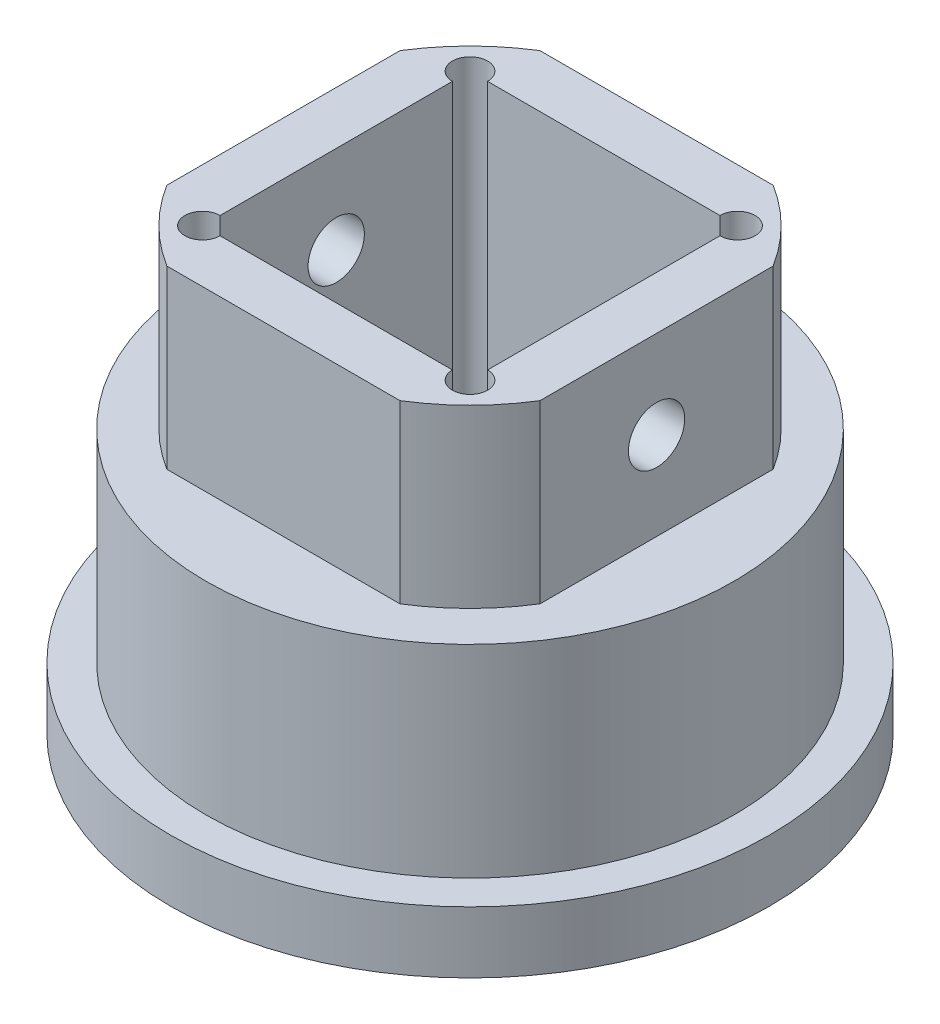
ISO-10303-21;
HEADER;
FILE_DESCRIPTION(('STEP AP214'),'2;1');
FILE_NAME('part.step','',(''),(''),'','','');
FILE_SCHEMA(('AUTOMOTIVE_DESIGN { 1 0 10303 214 1 1 1 1 }'));
ENDSEC;
DATA;
#1=APPLICATION_CONTEXT('core data for automotive mechanical design processes');
#2=APPLICATION_PROTOCOL_DEFINITION('international standard','automotive_design',2000,#1);
#3=PRODUCT_CONTEXT('',#1,'mechanical');
#4=PRODUCT('Part','Part','',(#3));
#5=PRODUCT_RELATED_PRODUCT_CATEGORY('part','',(#4));
#6=PRODUCT_DEFINITION_FORMATION('','',#4);
#7=PRODUCT_DEFINITION_CONTEXT('part definition',#1,'design');
#8=PRODUCT_DEFINITION('design','',#6,#7);
#9=PRODUCT_DEFINITION_SHAPE('','',#8);
#10=(LENGTH_UNIT() NAMED_UNIT(*) SI_UNIT(.MILLI.,.METRE.));
#11=(NAMED_UNIT(*) PLANE_ANGLE_UNIT() SI_UNIT($,.RADIAN.));
#12=(NAMED_UNIT(*) SI_UNIT($,.STERADIAN.) SOLID_ANGLE_UNIT());
#13=UNCERTAINTY_MEASURE_WITH_UNIT(LENGTH_MEASURE(1.E-05),#10,'distance_accuracy_value','');
#14=(GEOMETRIC_REPRESENTATION_CONTEXT(3) GLOBAL_UNCERTAINTY_ASSIGNED_CONTEXT((#13)) GLOBAL_UNIT_ASSIGNED_CONTEXT((#10,
#11,#12)) REPRESENTATION_CONTEXT('',''));
#15=CARTESIAN_POINT('',(0.,0.,0.));
#16=DIRECTION('',(0.,0.,1.));
#17=DIRECTION('',(1.,0.,0.));
#18=AXIS2_PLACEMENT_3D('',#15,#16,#17);
#19=CARTESIAN_POINT('',(0.,7.5,0.));
#20=DIRECTION('',(0.,-1.,0.));
#21=DIRECTION('',(0.,0.,-1.));
#22=AXIS2_PLACEMENT_3D('',#19,#20,#21);
#23=CYLINDRICAL_SURFACE('',#22,12.5);
#24=DIRECTION('',(0.,-1.,0.));
#25=VECTOR('',#24,1.);
#26=CARTESIAN_POINT('',(6.62495283002075,17.5,10.6));
#27=LINE('',#26,#25);
#28=CARTESIAN_POINT('',(6.62495283002075,17.5,10.6));
#29=VERTEX_POINT('',#28);
#30=CARTESIAN_POINT('',(6.62495283002074,7.5,10.6));
#31=VERTEX_POINT('',#30);
#32=EDGE_CURVE('E158',#29,#31,#27,.T.);
#33=ORIENTED_EDGE('',*,*,#32,.T.);
#34=CARTESIAN_POINT('',(0.,7.5,0.));
#35=DIRECTION('',(0.,1.,0.));
#36=DIRECTION('',(0.,0.,1.));
#37=AXIS2_PLACEMENT_3D('',#34,#35,#36);
#38=CIRCLE('',#37,12.5);
#39=CARTESIAN_POINT('',(10.6,7.5,6.62495283002075));
#40=VERTEX_POINT('',#39);
#41=EDGE_CURVE('E365',#31,#40,#38,.T.);
#42=ORIENTED_EDGE('',*,*,#41,.T.);
#43=DIRECTION('',(0.,-1.,0.));
#44=VECTOR('',#43,1.);
#45=CARTESIAN_POINT('',(10.6,17.5,6.62495283002075));
#46=LINE('',#45,#44);
#47=CARTESIAN_POINT('',(10.6,17.5,6.62495283002075));
#48=VERTEX_POINT('',#47);
#49=EDGE_CURVE('E166',#48,#40,#46,.T.);
#50=ORIENTED_EDGE('',*,*,#49,.F.);
#51=CARTESIAN_POINT('',(0.,17.5,0.));
#52=DIRECTION('',(0.,-1.,0.));
#53=DIRECTION('',(0.,0.,-1.));
#54=AXIS2_PLACEMENT_3D('',#51,#52,#53);
#55=CIRCLE('',#54,12.5);
#56=EDGE_CURVE('E149',#48,#29,#55,.T.);
#57=ORIENTED_EDGE('',*,*,#56,.T.);
#58=EDGE_LOOP('',(#33,#42,#50,#57));
#59=FACE_BOUND('',#58,.T.);
#60=ADVANCED_FACE('F51',(#59),#23,.T.);
#61=DIRECTION('',(0.,-1.,0.));
#62=VECTOR('',#61,1.);
#63=CARTESIAN_POINT('',(10.6,17.5,-6.62495283002075));
#64=LINE('',#63,#62);
#65=CARTESIAN_POINT('',(10.6,17.5,-6.62495283002075));
#66=VERTEX_POINT('',#65);
#67=CARTESIAN_POINT('',(10.6,7.5,-6.62495283002075));
#68=VERTEX_POINT('',#67);
#69=EDGE_CURVE('E76',#66,#68,#64,.T.);
#70=ORIENTED_EDGE('',*,*,#69,.T.);
#71=CARTESIAN_POINT('',(6.62495283002075,7.5,-10.6));
#72=VERTEX_POINT('',#71);
#73=EDGE_CURVE('E463',#68,#72,#38,.T.);
#74=ORIENTED_EDGE('',*,*,#73,.T.);
#75=DIRECTION('',(0.,-1.,0.));
#76=VECTOR('',#75,1.);
#77=CARTESIAN_POINT('',(6.62495283002076,17.5,-10.6));
#78=LINE('',#77,#76);
#79=CARTESIAN_POINT('',(6.62495283002076,17.5,-10.6));
#80=VERTEX_POINT('',#79);
#81=EDGE_CURVE('E235',#80,#72,#78,.T.);
#82=ORIENTED_EDGE('',*,*,#81,.F.);
#83=EDGE_CURVE('E172',#80,#66,#55,.T.);
#84=ORIENTED_EDGE('',*,*,#83,.T.);
#85=EDGE_LOOP('',(#70,#74,#82,#84));
#86=FACE_BOUND('',#85,.T.);
#87=ADVANCED_FACE('F478',(#86),#23,.T.);
#88=DIRECTION('',(0.,-1.,0.));
#89=VECTOR('',#88,1.);
#90=CARTESIAN_POINT('',(-6.62495283002076,17.5,-10.6));
#91=LINE('',#90,#89);
#92=CARTESIAN_POINT('',(-6.62495283002076,17.5,-10.6));
#93=VERTEX_POINT('',#92);
#94=CARTESIAN_POINT('',(-6.62495283002075,7.5,-10.6));
#95=VERTEX_POINT('',#94);
#96=EDGE_CURVE('E232',#93,#95,#91,.T.);
#97=ORIENTED_EDGE('',*,*,#96,.T.);
#98=CARTESIAN_POINT('',(-10.6,7.5,-6.62495283002075));
#99=VERTEX_POINT('',#98);
#100=EDGE_CURVE('E467',#95,#99,#38,.T.);
#101=ORIENTED_EDGE('',*,*,#100,.T.);
#102=DIRECTION('',(0.,-1.,0.));
#103=VECTOR('',#102,1.);
#104=CARTESIAN_POINT('',(-10.6,17.5,-6.62495283002076));
#105=LINE('',#104,#103);
#106=CARTESIAN_POINT('',(-10.6,17.5,-6.62495283002076));
#107=VERTEX_POINT('',#106);
#108=EDGE_CURVE('E228',#107,#99,#105,.T.);
#109=ORIENTED_EDGE('',*,*,#108,.F.);
#110=EDGE_CURVE('E180',#107,#93,#55,.T.);
#111=ORIENTED_EDGE('',*,*,#110,.T.);
#112=EDGE_LOOP('',(#97,#101,#109,#111));
#113=FACE_BOUND('',#112,.T.);
#114=ADVANCED_FACE('F471',(#113),#23,.T.);
#115=CARTESIAN_POINT('',(0.,-4.,0.));
#116=DIRECTION('',(0.,1.,0.));
#117=DIRECTION('',(0.,0.,1.));
#118=AXIS2_PLACEMENT_3D('',#115,#116,#117);
#119=PLANE('',#118);
#120=CARTESIAN_POINT('',(0.,-4.,0.));
#121=DIRECTION('',(0.,1.,0.));
#122=DIRECTION('',(0.,0.,1.));
#123=AXIS2_PLACEMENT_3D('',#120,#121,#122);
#124=CIRCLE('',#123,17.);
#125=CARTESIAN_POINT('',(0.,-4.,17.));
#126=VERTEX_POINT('',#125);
#127=EDGE_CURVE('E351',#126,#126,#124,.T.);
#128=ORIENTED_EDGE('',*,*,#127,.T.);
#129=EDGE_LOOP('',(#128));
#130=FACE_BOUND('',#129,.T.);
#131=CARTESIAN_POINT('',(0.,-4.,0.));
#132=DIRECTION('',(0.,1.,0.));
#133=DIRECTION('',(0.,0.,1.));
#134=AXIS2_PLACEMENT_3D('',#131,#132,#133);
#135=CIRCLE('',#134,15.);
#136=CARTESIAN_POINT('',(0.,-4.,15.));
#137=VERTEX_POINT('',#136);
#138=EDGE_CURVE('E362',#137,#137,#135,.T.);
#139=ORIENTED_EDGE('',*,*,#138,.F.);
#140=EDGE_LOOP('',(#139));
#141=FACE_BOUND('',#140,.T.);
#142=ADVANCED_FACE('F508',(#130,#141),#119,.T.);
#143=CARTESIAN_POINT('',(-7.6,7.5,-7.6));
#144=DIRECTION('',(0.,-1.,0.));
#145=DIRECTION('',(0.,0.,-1.));
#146=AXIS2_PLACEMENT_3D('',#143,#144,#145);
#147=CYLINDRICAL_SURFACE('',#146,1.);
#148=DIRECTION('',(0.,-1.,0.));
#149=VECTOR('',#148,1.);
#150=CARTESIAN_POINT('',(-7.6,7.5,-6.6));
#151=LINE('',#150,#149);
#152=CARTESIAN_POINT('',(-7.6,17.5,-6.6));
#153=VERTEX_POINT('',#152);
#154=CARTESIAN_POINT('',(-7.6,-7.5,-6.6));
#155=VERTEX_POINT('',#154);
#156=EDGE_CURVE('E239',#153,#155,#151,.T.);
#157=ORIENTED_EDGE('',*,*,#156,.T.);
#158=CARTESIAN_POINT('',(-7.6,-7.5,-7.6));
#159=DIRECTION('',(0.,-1.,0.));
#160=DIRECTION('',(0.,0.,-1.));
#161=AXIS2_PLACEMENT_3D('',#158,#159,#160);
#162=CIRCLE('',#161,1.);
#163=CARTESIAN_POINT('',(-6.6,-7.5,-7.6));
#164=VERTEX_POINT('',#163);
#165=EDGE_CURVE('E67',#155,#164,#162,.T.);
#166=ORIENTED_EDGE('',*,*,#165,.T.);
#167=DIRECTION('',(0.,-1.,0.));
#168=VECTOR('',#167,1.);
#169=CARTESIAN_POINT('',(-6.6,7.5,-7.6));
#170=LINE('',#169,#168);
#171=CARTESIAN_POINT('',(-6.6,17.5,-7.6));
#172=VERTEX_POINT('',#171);
#173=EDGE_CURVE('E11',#172,#164,#170,.T.);
#174=ORIENTED_EDGE('',*,*,#173,.F.);
#175=CARTESIAN_POINT('',(-7.6,17.5,-7.6));
#176=DIRECTION('',(0.,-1.,0.));
#177=DIRECTION('',(0.,0.,-1.));
#178=AXIS2_PLACEMENT_3D('',#175,#176,#177);
#179=CIRCLE('',#178,1.);
#180=EDGE_CURVE('E183',#172,#153,#179,.F.);
#181=ORIENTED_EDGE('',*,*,#180,.T.);
#182=EDGE_LOOP('',(#157,#166,#174,#181));
#183=FACE_BOUND('',#182,.T.);
#184=ADVANCED_FACE('F53',(#183),#147,.F.);
#185=CARTESIAN_POINT('',(0.,7.5,-7.6));
#186=DIRECTION('',(0.,0.,-1.));
#187=DIRECTION('',(-1.,0.,0.));
#188=AXIS2_PLACEMENT_3D('',#185,#186,#187);
#189=PLANE('',#188);
#190=DIRECTION('',(-1.,0.,0.));
#191=VECTOR('',#190,1.);
#192=CARTESIAN_POINT('',(0.,-7.5,-7.6));
#193=LINE('',#192,#191);
#194=CARTESIAN_POINT('',(6.6,-7.5,-7.6));
#195=VERTEX_POINT('',#194);
#196=EDGE_CURVE('E99',#195,#164,#193,.T.);
#197=ORIENTED_EDGE('',*,*,#196,.F.);
#198=DIRECTION('',(0.,-1.,0.));
#199=VECTOR('',#198,1.);
#200=CARTESIAN_POINT('',(6.6,7.5,-7.6));
#201=LINE('',#200,#199);
#202=CARTESIAN_POINT('',(6.6,17.5,-7.6));
#203=VERTEX_POINT('',#202);
#204=EDGE_CURVE('E60',#203,#195,#201,.T.);
#205=ORIENTED_EDGE('',*,*,#204,.F.);
#206=DIRECTION('',(-1.,0.,0.));
#207=VECTOR('',#206,1.);
#208=CARTESIAN_POINT('',(0.,17.5,-7.6));
#209=LINE('',#208,#207);
#210=EDGE_CURVE('E218',#203,#172,#209,.T.);
#211=ORIENTED_EDGE('',*,*,#210,.T.);
#212=ORIENTED_EDGE('',*,*,#173,.T.);
#213=EDGE_LOOP('',(#197,#205,#211,#212));
#214=FACE_BOUND('',#213,.T.);
#215=ADVANCED_FACE('F275',(#214),#189,.F.);
#216=CARTESIAN_POINT('',(7.6,7.5,-7.6));
#217=DIRECTION('',(0.,-1.,0.));
#218=DIRECTION('',(0.,0.,-1.));
#219=AXIS2_PLACEMENT_3D('',#216,#217,#218);
#220=CYLINDRICAL_SURFACE('',#219,1.);
#221=ORIENTED_EDGE('',*,*,#204,.T.);
#222=CARTESIAN_POINT('',(7.6,-7.5,-7.6));
#223=DIRECTION('',(0.,-1.,0.));
#224=DIRECTION('',(0.,0.,-1.));
#225=AXIS2_PLACEMENT_3D('',#222,#223,#224);
#226=CIRCLE('',#225,1.);
#227=CARTESIAN_POINT('',(7.6,-7.5,-6.6));
#228=VERTEX_POINT('',#227);
#229=EDGE_CURVE('E269',#195,#228,#226,.T.);
#230=ORIENTED_EDGE('',*,*,#229,.T.);
#231=DIRECTION('',(0.,-1.,0.));
#232=VECTOR('',#231,1.);
#233=CARTESIAN_POINT('',(7.6,7.5,-6.6));
#234=LINE('',#233,#232);
#235=CARTESIAN_POINT('',(7.6,17.5,-6.6));
#236=VERTEX_POINT('',#235);
#237=EDGE_CURVE('E259',#236,#228,#234,.T.);
#238=ORIENTED_EDGE('',*,*,#237,.F.);
#239=CARTESIAN_POINT('',(7.6,17.5,-7.6));
#240=DIRECTION('',(0.,-1.,0.));
#241=DIRECTION('',(0.,0.,-1.));
#242=AXIS2_PLACEMENT_3D('',#239,#240,#241);
#243=CIRCLE('',#242,1.);
#244=EDGE_CURVE('E271',#236,#203,#243,.F.);
#245=ORIENTED_EDGE('',*,*,#244,.T.);
#246=EDGE_LOOP('',(#221,#230,#238,#245));
#247=FACE_BOUND('',#246,.T.);
#248=ADVANCED_FACE('F268',(#247),#220,.F.);
#249=CARTESIAN_POINT('',(7.6,7.5,0.));
#250=DIRECTION('',(-1.,0.,0.));
#251=DIRECTION('',(0.,0.,1.));
#252=AXIS2_PLACEMENT_3D('',#249,#250,#251);
#253=PLANE('',#252);
#254=CARTESIAN_POINT('',(7.6,12.5,0.));
#255=DIRECTION('',(-1.,0.,0.));
#256=DIRECTION('',(0.,0.,1.));
#257=AXIS2_PLACEMENT_3D('',#254,#255,#256);
#258=CIRCLE('',#257,1.6);
#259=CARTESIAN_POINT('',(7.6,12.5,1.6));
#260=VERTEX_POINT('',#259);
#261=EDGE_CURVE('E331',#260,#260,#258,.T.);
#262=ORIENTED_EDGE('',*,*,#261,.F.);
#263=EDGE_LOOP('',(#262));
#264=FACE_BOUND('',#263,.T.);
#265=ORIENTED_EDGE('',*,*,#237,.T.);
#266=DIRECTION('',(0.,0.,1.));
#267=VECTOR('',#266,1.);
#268=CARTESIAN_POINT('',(7.6,-7.5,0.));
#269=LINE('',#268,#267);
#270=CARTESIAN_POINT('',(7.6,-7.5,6.6));
#271=VERTEX_POINT('',#270);
#272=EDGE_CURVE('E379',#228,#271,#269,.T.);
#273=ORIENTED_EDGE('',*,*,#272,.T.);
#274=DIRECTION('',(0.,-1.,0.));
#275=VECTOR('',#274,1.);
#276=CARTESIAN_POINT('',(7.6,7.5,6.6));
#277=LINE('',#276,#275);
#278=CARTESIAN_POINT('',(7.6,17.5,6.6));
#279=VERTEX_POINT('',#278);
#280=EDGE_CURVE('E255',#279,#271,#277,.T.);
#281=ORIENTED_EDGE('',*,*,#280,.F.);
#282=DIRECTION('',(0.,0.,-1.));
#283=VECTOR('',#282,1.);
#284=CARTESIAN_POINT('',(7.6,17.5,0.));
#285=LINE('',#284,#283);
#286=EDGE_CURVE('E285',#279,#236,#285,.T.);
#287=ORIENTED_EDGE('',*,*,#286,.T.);
#288=EDGE_LOOP('',(#265,#273,#281,#287));
#289=FACE_BOUND('',#288,.T.);
#290=ADVANCED_FACE('F425',(#264,#289),#253,.T.);
#291=CARTESIAN_POINT('',(7.6,7.5,7.6));
#292=DIRECTION('',(0.,-1.,0.));
#293=DIRECTION('',(0.,0.,-1.));
#294=AXIS2_PLACEMENT_3D('',#291,#292,#293);
#295=CYLINDRICAL_SURFACE('',#294,1.);
#296=ORIENTED_EDGE('',*,*,#280,.T.);
#297=CARTESIAN_POINT('',(7.6,-7.5,7.6));
#298=DIRECTION('',(0.,-1.,0.));
#299=DIRECTION('',(0.,0.,-1.));
#300=AXIS2_PLACEMENT_3D('',#297,#298,#299);
#301=CIRCLE('',#300,1.);
#302=CARTESIAN_POINT('',(6.6,-7.5,7.6));
#303=VERTEX_POINT('',#302);
#304=EDGE_CURVE('E375',#271,#303,#301,.T.);
#305=ORIENTED_EDGE('',*,*,#304,.T.);
#306=DIRECTION('',(0.,-1.,0.));
#307=VECTOR('',#306,1.);
#308=CARTESIAN_POINT('',(6.6,7.5,7.6));
#309=LINE('',#308,#307);
#310=CARTESIAN_POINT('',(6.6,17.5,7.6));
#311=VERTEX_POINT('',#310);
#312=EDGE_CURVE('E251',#311,#303,#309,.T.);
#313=ORIENTED_EDGE('',*,*,#312,.F.);
#314=CARTESIAN_POINT('',(7.6,17.5,7.6));
#315=DIRECTION('',(0.,-1.,0.));
#316=DIRECTION('',(0.,0.,-1.));
#317=AXIS2_PLACEMENT_3D('',#314,#315,#316);
#318=CIRCLE('',#317,1.);
#319=EDGE_CURVE('E292',#311,#279,#318,.F.);
#320=ORIENTED_EDGE('',*,*,#319,.T.);
#321=EDGE_LOOP('',(#296,#305,#313,#320));
#322=FACE_BOUND('',#321,.T.);
#323=ADVANCED_FACE('F430',(#322),#295,.F.);
#324=CARTESIAN_POINT('',(0.,7.5,7.6));
#325=DIRECTION('',(0.,0.,-1.));
#326=DIRECTION('',(-1.,0.,0.));
#327=AXIS2_PLACEMENT_3D('',#324,#325,#326);
#328=PLANE('',#327);
#329=ORIENTED_EDGE('',*,*,#312,.T.);
#330=DIRECTION('',(-1.,0.,0.));
#331=VECTOR('',#330,1.);
#332=CARTESIAN_POINT('',(0.,-7.5,7.6));
#333=LINE('',#332,#331);
#334=CARTESIAN_POINT('',(-6.6,-7.5,7.6));
#335=VERTEX_POINT('',#334);
#336=EDGE_CURVE('E371',#303,#335,#333,.T.);
#337=ORIENTED_EDGE('',*,*,#336,.T.);
#338=DIRECTION('',(0.,-1.,0.));
#339=VECTOR('',#338,1.);
#340=CARTESIAN_POINT('',(-6.6,7.5,7.6));
#341=LINE('',#340,#339);
#342=CARTESIAN_POINT('',(-6.6,17.5,7.6));
#343=VERTEX_POINT('',#342);
#344=EDGE_CURVE('E247',#343,#335,#341,.T.);
#345=ORIENTED_EDGE('',*,*,#344,.F.);
#346=DIRECTION('',(1.,0.,0.));
#347=VECTOR('',#346,1.);
#348=CARTESIAN_POINT('',(0.,17.5,7.6));
#349=LINE('',#348,#347);
#350=EDGE_CURVE('E296',#343,#311,#349,.T.);
#351=ORIENTED_EDGE('',*,*,#350,.T.);
#352=EDGE_LOOP('',(#329,#337,#345,#351));
#353=FACE_BOUND('',#352,.T.);
#354=ADVANCED_FACE('F433',(#353),#328,.T.);
#355=CARTESIAN_POINT('',(-7.6,7.5,7.6));
#356=DIRECTION('',(0.,-1.,0.));
#357=DIRECTION('',(0.,0.,-1.));
#358=AXIS2_PLACEMENT_3D('',#355,#356,#357);
#359=CYLINDRICAL_SURFACE('',#358,1.);
#360=ORIENTED_EDGE('',*,*,#344,.T.);
#361=CARTESIAN_POINT('',(-7.6,-7.5,7.6));
#362=DIRECTION('',(0.,-1.,0.));
#363=DIRECTION('',(0.,0.,-1.));
#364=AXIS2_PLACEMENT_3D('',#361,#362,#363);
#365=CIRCLE('',#364,1.);
#366=CARTESIAN_POINT('',(-7.6,-7.5,6.6));
#367=VERTEX_POINT('',#366);
#368=EDGE_CURVE('E359',#335,#367,#365,.T.);
#369=ORIENTED_EDGE('',*,*,#368,.T.);
#370=DIRECTION('',(0.,-1.,0.));
#371=VECTOR('',#370,1.);
#372=CARTESIAN_POINT('',(-7.6,7.5,6.6));
#373=LINE('',#372,#371);
#374=CARTESIAN_POINT('',(-7.6,17.5,6.6));
#375=VERTEX_POINT('',#374);
#376=EDGE_CURVE('E243',#375,#367,#373,.T.);
#377=ORIENTED_EDGE('',*,*,#376,.F.);
#378=CARTESIAN_POINT('',(-7.6,17.5,7.6));
#379=DIRECTION('',(0.,-1.,0.));
#380=DIRECTION('',(0.,0.,-1.));
#381=AXIS2_PLACEMENT_3D('',#378,#379,#380);
#382=CIRCLE('',#381,1.);
#383=EDGE_CURVE('E300',#375,#343,#382,.F.);
#384=ORIENTED_EDGE('',*,*,#383,.T.);
#385=EDGE_LOOP('',(#360,#369,#377,#384));
#386=FACE_BOUND('',#385,.T.);
#387=ADVANCED_FACE('F437',(#386),#359,.F.);
#388=CARTESIAN_POINT('',(-7.6,7.5,0.));
#389=DIRECTION('',(-1.,0.,0.));
#390=DIRECTION('',(0.,0.,1.));
#391=AXIS2_PLACEMENT_3D('',#388,#389,#390);
#392=PLANE('',#391);
#393=CARTESIAN_POINT('',(-7.6,12.5,0.));
#394=DIRECTION('',(-1.,0.,0.));
#395=DIRECTION('',(0.,0.,1.));
#396=AXIS2_PLACEMENT_3D('',#393,#394,#395);
#397=CIRCLE('',#396,1.6);
#398=CARTESIAN_POINT('',(-7.6,12.5,1.6));
#399=VERTEX_POINT('',#398);
#400=EDGE_CURVE('E328',#399,#399,#397,.T.);
#401=ORIENTED_EDGE('',*,*,#400,.T.);
#402=EDGE_LOOP('',(#401));
#403=FACE_BOUND('',#402,.T.);
#404=DIRECTION('',(0.,0.,1.));
#405=VECTOR('',#404,1.);
#406=CARTESIAN_POINT('',(-7.6,-7.5,0.));
#407=LINE('',#406,#405);
#408=EDGE_CURVE('E354',#155,#367,#407,.T.);
#409=ORIENTED_EDGE('',*,*,#408,.F.);
#410=ORIENTED_EDGE('',*,*,#156,.F.);
#411=DIRECTION('',(0.,0.,1.));
#412=VECTOR('',#411,1.);
#413=CARTESIAN_POINT('',(-7.6,17.5,0.));
#414=LINE('',#413,#412);
#415=EDGE_CURVE('E190',#153,#375,#414,.T.);
#416=ORIENTED_EDGE('',*,*,#415,.T.);
#417=ORIENTED_EDGE('',*,*,#376,.T.);
#418=EDGE_LOOP('',(#409,#410,#416,#417));
#419=FACE_BOUND('',#418,.T.);
#420=ADVANCED_FACE('F308',(#403,#419),#392,.F.);
#421=DIRECTION('',(0.,-1.,0.));
#422=VECTOR('',#421,1.);
#423=CARTESIAN_POINT('',(-10.6,17.5,6.62495283002076));
#424=LINE('',#423,#422);
#425=CARTESIAN_POINT('',(-10.6,17.5,6.62495283002076));
#426=VERTEX_POINT('',#425);
#427=CARTESIAN_POINT('',(-10.6,7.5,6.62495283002076));
#428=VERTEX_POINT('',#427);
#429=EDGE_CURVE('E225',#426,#428,#424,.T.);
#430=ORIENTED_EDGE('',*,*,#429,.T.);
#431=CARTESIAN_POINT('',(-6.62495283002074,7.5,10.6));
#432=VERTEX_POINT('',#431);
#433=EDGE_CURVE('E90',#428,#432,#38,.T.);
#434=ORIENTED_EDGE('',*,*,#433,.T.);
#435=DIRECTION('',(0.,-1.,0.));
#436=VECTOR('',#435,1.);
#437=CARTESIAN_POINT('',(-6.62495283002075,17.5,10.6));
#438=LINE('',#437,#436);
#439=CARTESIAN_POINT('',(-6.62495283002075,17.5,10.6));
#440=VERTEX_POINT('',#439);
#441=EDGE_CURVE('E165',#440,#432,#438,.T.);
#442=ORIENTED_EDGE('',*,*,#441,.F.);
#443=EDGE_CURVE('E151',#440,#426,#55,.T.);
#444=ORIENTED_EDGE('',*,*,#443,.T.);
#445=EDGE_LOOP('',(#430,#434,#442,#444));
#446=FACE_BOUND('',#445,.T.);
#447=ADVANCED_FACE('F493',(#446),#23,.T.);
#448=CARTESIAN_POINT('',(0.,7.5,0.));
#449=DIRECTION('',(0.,1.,0.));
#450=DIRECTION('',(0.,0.,1.));
#451=AXIS2_PLACEMENT_3D('',#448,#449,#450);
#452=PLANE('',#451);
#453=DIRECTION('',(0.,0.,1.));
#454=VECTOR('',#453,1.);
#455=CARTESIAN_POINT('',(-10.6,7.5,0.));
#456=LINE('',#455,#454);
#457=EDGE_CURVE('E207',#99,#428,#456,.T.);
#458=ORIENTED_EDGE('',*,*,#457,.F.);
#459=ORIENTED_EDGE('',*,*,#100,.F.);
#460=DIRECTION('',(1.,0.,0.));
#461=VECTOR('',#460,1.);
#462=CARTESIAN_POINT('',(0.,7.5,-10.6));
#463=LINE('',#462,#461);
#464=EDGE_CURVE('E203',#95,#72,#463,.T.);
#465=ORIENTED_EDGE('',*,*,#464,.T.);
#466=ORIENTED_EDGE('',*,*,#73,.F.);
#467=DIRECTION('',(0.,0.,1.));
#468=VECTOR('',#467,1.);
#469=CARTESIAN_POINT('',(10.6,7.5,0.));
#470=LINE('',#469,#468);
#471=EDGE_CURVE('E214',#68,#40,#470,.T.);
#472=ORIENTED_EDGE('',*,*,#471,.T.);
#473=ORIENTED_EDGE('',*,*,#41,.F.);
#474=DIRECTION('',(1.,0.,0.));
#475=VECTOR('',#474,1.);
#476=CARTESIAN_POINT('',(0.,7.5,10.6));
#477=LINE('',#476,#475);
#478=EDGE_CURVE('E161',#432,#31,#477,.T.);
#479=ORIENTED_EDGE('',*,*,#478,.F.);
#480=ORIENTED_EDGE('',*,*,#433,.F.);
#481=EDGE_LOOP('',(#458,#459,#465,#466,#472,#473,#479,#480));
#482=FACE_BOUND('',#481,.T.);
#483=CARTESIAN_POINT('',(0.,7.5,0.));
#484=DIRECTION('',(0.,1.,0.));
#485=DIRECTION('',(0.,0.,1.));
#486=AXIS2_PLACEMENT_3D('',#483,#484,#485);
#487=CIRCLE('',#486,15.);
#488=CARTESIAN_POINT('',(0.,7.5,15.));
#489=VERTEX_POINT('',#488);
#490=EDGE_CURVE('E355',#489,#489,#487,.T.);
#491=ORIENTED_EDGE('',*,*,#490,.T.);
#492=EDGE_LOOP('',(#491));
#493=FACE_BOUND('',#492,.T.);
#494=ADVANCED_FACE('F460',(#482,#493),#452,.T.);
#495=CARTESIAN_POINT('',(0.,-7.5,0.));
#496=DIRECTION('',(0.,1.,0.));
#497=DIRECTION('',(0.,0.,1.));
#498=AXIS2_PLACEMENT_3D('',#495,#496,#497);
#499=PLANE('',#498);
#500=CARTESIAN_POINT('',(0.,-7.5,0.));
#501=DIRECTION('',(0.,-1.,0.));
#502=DIRECTION('',(0.,0.,-1.));
#503=AXIS2_PLACEMENT_3D('',#500,#501,#502);
#504=CIRCLE('',#503,17.);
#505=CARTESIAN_POINT('',(0.,-7.5,-17.));
#506=VERTEX_POINT('',#505);
#507=EDGE_CURVE('E208',#506,#506,#504,.T.);
#508=ORIENTED_EDGE('',*,*,#507,.T.);
#509=EDGE_LOOP('',(#508));
#510=FACE_BOUND('',#509,.T.);
#511=ORIENTED_EDGE('',*,*,#408,.T.);
#512=ORIENTED_EDGE('',*,*,#368,.F.);
#513=ORIENTED_EDGE('',*,*,#336,.F.);
#514=ORIENTED_EDGE('',*,*,#304,.F.);
#515=ORIENTED_EDGE('',*,*,#272,.F.);
#516=ORIENTED_EDGE('',*,*,#229,.F.);
#517=ORIENTED_EDGE('',*,*,#196,.T.);
#518=ORIENTED_EDGE('',*,*,#165,.F.);
#519=EDGE_LOOP('',(#511,#512,#513,#514,#515,#516,#517,#518));
#520=FACE_BOUND('',#519,.T.);
#521=ADVANCED_FACE('F342',(#510,#520),#499,.F.);
#522=CARTESIAN_POINT('',(0.,17.5,-10.6));
#523=DIRECTION('',(0.,0.,-1.));
#524=DIRECTION('',(-1.,0.,0.));
#525=AXIS2_PLACEMENT_3D('',#522,#523,#524);
#526=PLANE('',#525);
#527=ORIENTED_EDGE('',*,*,#464,.F.);
#528=ORIENTED_EDGE('',*,*,#96,.F.);
#529=DIRECTION('',(1.,0.,0.));
#530=VECTOR('',#529,1.);
#531=CARTESIAN_POINT('',(0.,17.5,-10.6));
#532=LINE('',#531,#530);
#533=EDGE_CURVE('E182',#93,#80,#532,.T.);
#534=ORIENTED_EDGE('',*,*,#533,.T.);
#535=ORIENTED_EDGE('',*,*,#81,.T.);
#536=EDGE_LOOP('',(#527,#528,#534,#535));
#537=FACE_BOUND('',#536,.T.);
#538=ADVANCED_FACE('F477',(#537),#526,.T.);
#539=CARTESIAN_POINT('',(-10.6,17.5,0.));
#540=DIRECTION('',(1.,0.,0.));
#541=DIRECTION('',(0.,0.,-1.));
#542=AXIS2_PLACEMENT_3D('',#539,#540,#541);
#543=PLANE('',#542);
#544=CARTESIAN_POINT('',(-10.6,12.5,0.));
#545=DIRECTION('',(1.,0.,0.));
#546=DIRECTION('',(0.,0.,-1.));
#547=AXIS2_PLACEMENT_3D('',#544,#545,#546);
#548=CIRCLE('',#547,1.6);
#549=CARTESIAN_POINT('',(-10.6,12.5,-1.6));
#550=VERTEX_POINT('',#549);
#551=EDGE_CURVE('E320',#550,#550,#548,.T.);
#552=ORIENTED_EDGE('',*,*,#551,.T.);
#553=EDGE_LOOP('',(#552));
#554=FACE_BOUND('',#553,.T.);
#555=ORIENTED_EDGE('',*,*,#457,.T.);
#556=ORIENTED_EDGE('',*,*,#429,.F.);
#557=DIRECTION('',(0.,0.,1.));
#558=VECTOR('',#557,1.);
#559=CARTESIAN_POINT('',(-10.6,17.5,0.));
#560=LINE('',#559,#558);
#561=EDGE_CURVE('E179',#107,#426,#560,.T.);
#562=ORIENTED_EDGE('',*,*,#561,.F.);
#563=ORIENTED_EDGE('',*,*,#108,.T.);
#564=EDGE_LOOP('',(#555,#556,#562,#563));
#565=FACE_BOUND('',#564,.T.);
#566=ADVANCED_FACE('F474',(#554,#565),#543,.F.);
#567=CARTESIAN_POINT('',(0.,17.5,10.6));
#568=DIRECTION('',(0.,0.,-1.));
#569=DIRECTION('',(-1.,0.,0.));
#570=AXIS2_PLACEMENT_3D('',#567,#568,#569);
#571=PLANE('',#570);
#572=ORIENTED_EDGE('',*,*,#478,.T.);
#573=ORIENTED_EDGE('',*,*,#32,.F.);
#574=DIRECTION('',(1.,0.,0.));
#575=VECTOR('',#574,1.);
#576=CARTESIAN_POINT('',(0.,17.5,10.6));
#577=LINE('',#576,#575);
#578=EDGE_CURVE('E143',#440,#29,#577,.T.);
#579=ORIENTED_EDGE('',*,*,#578,.F.);
#580=ORIENTED_EDGE('',*,*,#441,.T.);
#581=EDGE_LOOP('',(#572,#573,#579,#580));
#582=FACE_BOUND('',#581,.T.);
#583=ADVANCED_FACE('F159',(#582),#571,.F.);
#584=CARTESIAN_POINT('',(10.6,17.5,0.));
#585=DIRECTION('',(1.,0.,0.));
#586=DIRECTION('',(0.,0.,-1.));
#587=AXIS2_PLACEMENT_3D('',#584,#585,#586);
#588=PLANE('',#587);
#589=CARTESIAN_POINT('',(10.6,12.5,0.));
#590=DIRECTION('',(1.,0.,0.));
#591=DIRECTION('',(0.,0.,-1.));
#592=AXIS2_PLACEMENT_3D('',#589,#590,#591);
#593=CIRCLE('',#592,1.6);
#594=CARTESIAN_POINT('',(10.6,12.5,-1.6));
#595=VERTEX_POINT('',#594);
#596=EDGE_CURVE('E314',#595,#595,#593,.T.);
#597=ORIENTED_EDGE('',*,*,#596,.F.);
#598=EDGE_LOOP('',(#597));
#599=FACE_BOUND('',#598,.T.);
#600=ORIENTED_EDGE('',*,*,#471,.F.);
#601=ORIENTED_EDGE('',*,*,#69,.F.);
#602=DIRECTION('',(0.,0.,1.));
#603=VECTOR('',#602,1.);
#604=CARTESIAN_POINT('',(10.6,17.5,0.));
#605=LINE('',#604,#603);
#606=EDGE_CURVE('E170',#66,#48,#605,.T.);
#607=ORIENTED_EDGE('',*,*,#606,.T.);
#608=ORIENTED_EDGE('',*,*,#49,.T.);
#609=EDGE_LOOP('',(#600,#601,#607,#608));
#610=FACE_BOUND('',#609,.T.);
#611=ADVANCED_FACE('F479',(#599,#610),#588,.T.);
#612=CARTESIAN_POINT('',(0.,17.5,0.));
#613=DIRECTION('',(0.,1.,0.));
#614=DIRECTION('',(0.,0.,-1.));
#615=AXIS2_PLACEMENT_3D('',#612,#613,#614);
#616=PLANE('',#615);
#617=ORIENTED_EDGE('',*,*,#210,.F.);
#618=ORIENTED_EDGE('',*,*,#244,.F.);
#619=ORIENTED_EDGE('',*,*,#286,.F.);
#620=ORIENTED_EDGE('',*,*,#319,.F.);
#621=ORIENTED_EDGE('',*,*,#350,.F.);
#622=ORIENTED_EDGE('',*,*,#383,.F.);
#623=ORIENTED_EDGE('',*,*,#415,.F.);
#624=ORIENTED_EDGE('',*,*,#180,.F.);
#625=EDGE_LOOP('',(#617,#618,#619,#620,#621,#622,#623,#624));
#626=FACE_BOUND('',#625,.T.);
#627=ORIENTED_EDGE('',*,*,#83,.F.);
#628=ORIENTED_EDGE('',*,*,#533,.F.);
#629=ORIENTED_EDGE('',*,*,#110,.F.);
#630=ORIENTED_EDGE('',*,*,#561,.T.);
#631=ORIENTED_EDGE('',*,*,#443,.F.);
#632=ORIENTED_EDGE('',*,*,#578,.T.);
#633=ORIENTED_EDGE('',*,*,#56,.F.);
#634=ORIENTED_EDGE('',*,*,#606,.F.);
#635=EDGE_LOOP('',(#627,#628,#629,#630,#631,#632,#633,#634));
#636=FACE_BOUND('',#635,.T.);
#637=ADVANCED_FACE('F146',(#626,#636),#616,.T.);
#638=CARTESIAN_POINT('',(0.,-4.5,0.));
#639=DIRECTION('',(0.,-1.,0.));
#640=DIRECTION('',(0.,0.,-1.));
#641=AXIS2_PLACEMENT_3D('',#638,#639,#640);
#642=CYLINDRICAL_SURFACE('',#641,17.);
#643=ORIENTED_EDGE('',*,*,#507,.F.);
#644=EDGE_LOOP('',(#643));
#645=FACE_BOUND('',#644,.T.);
#646=ORIENTED_EDGE('',*,*,#127,.F.);
#647=EDGE_LOOP('',(#646));
#648=FACE_BOUND('',#647,.T.);
#649=ADVANCED_FACE('F344',(#645,#648),#642,.T.);
#650=CARTESIAN_POINT('',(-17.,12.5,0.));
#651=DIRECTION('',(1.,0.,0.));
#652=DIRECTION('',(0.,0.,-1.));
#653=AXIS2_PLACEMENT_3D('',#650,#651,#652);
#654=CYLINDRICAL_SURFACE('',#653,1.6);
#655=ORIENTED_EDGE('',*,*,#261,.T.);
#656=EDGE_LOOP('',(#655));
#657=FACE_BOUND('',#656,.T.);
#658=ORIENTED_EDGE('',*,*,#596,.T.);
#659=EDGE_LOOP('',(#658));
#660=FACE_BOUND('',#659,.T.);
#661=ADVANCED_FACE('F347',(#657,#660),#654,.F.);
#662=ORIENTED_EDGE('',*,*,#551,.F.);
#663=EDGE_LOOP('',(#662));
#664=FACE_BOUND('',#663,.T.);
#665=ORIENTED_EDGE('',*,*,#400,.F.);
#666=EDGE_LOOP('',(#665));
#667=FACE_BOUND('',#666,.T.);
#668=ADVANCED_FACE('F519',(#664,#667),#654,.F.);
#669=CARTESIAN_POINT('',(0.,49.9264068711929,0.));
#670=DIRECTION('',(0.,-1.,0.));
#671=DIRECTION('',(0.,0.,-1.));
#672=AXIS2_PLACEMENT_3D('',#669,#670,#671);
#673=CYLINDRICAL_SURFACE('',#672,15.);
#674=ORIENTED_EDGE('',*,*,#138,.T.);
#675=EDGE_LOOP('',(#674));
#676=FACE_BOUND('',#675,.T.);
#677=ORIENTED_EDGE('',*,*,#490,.F.);
#678=EDGE_LOOP('',(#677));
#679=FACE_BOUND('',#678,.T.);
#680=ADVANCED_FACE('F518',(#676,#679),#673,.T.);
#681=CLOSED_SHELL('',(#60,#87,#114,#142,#184,#215,#248,#290,#323,#354,#387,#420,#447,#494,#521,
#538,#566,#583,#611,#637,#649,#661,#668,#680));
#682=MANIFOLD_SOLID_BREP('B2',#681);
#683=ADVANCED_BREP_SHAPE_REPRESENTATION('',(#18,#682),#14);
#684=SHAPE_DEFINITION_REPRESENTATION(#9,#683);
ENDSEC;
END-ISO-10303-21;
